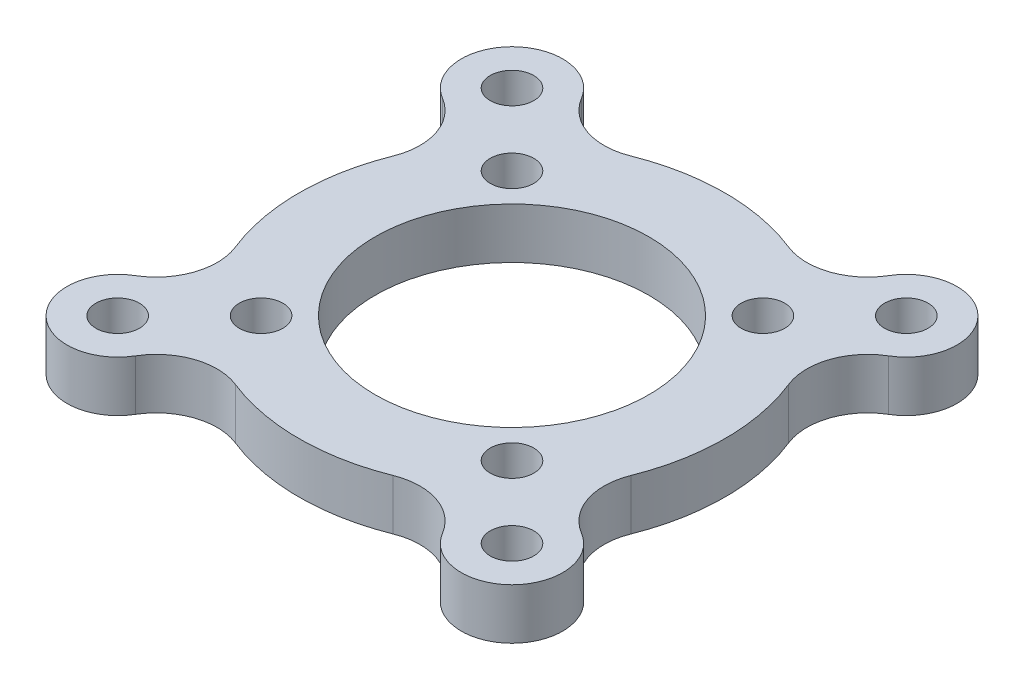
ISO-10303-21;
HEADER;
FILE_DESCRIPTION(('STEP AP214'),'2;1');
FILE_NAME('part.step','',(''),(''),'','','');
FILE_SCHEMA(('AUTOMOTIVE_DESIGN { 1 0 10303 214 1 1 1 1 }'));
ENDSEC;
DATA;
#1=APPLICATION_CONTEXT('core data for automotive mechanical design processes');
#2=APPLICATION_PROTOCOL_DEFINITION('international standard','automotive_design',2000,#1);
#3=PRODUCT_CONTEXT('',#1,'mechanical');
#4=PRODUCT('Part','Part','',(#3));
#5=PRODUCT_RELATED_PRODUCT_CATEGORY('part','',(#4));
#6=PRODUCT_DEFINITION_FORMATION('','',#4);
#7=PRODUCT_DEFINITION_CONTEXT('part definition',#1,'design');
#8=PRODUCT_DEFINITION('design','',#6,#7);
#9=PRODUCT_DEFINITION_SHAPE('','',#8);
#10=(LENGTH_UNIT() NAMED_UNIT(*) SI_UNIT(.MILLI.,.METRE.));
#11=(NAMED_UNIT(*) PLANE_ANGLE_UNIT() SI_UNIT($,.RADIAN.));
#12=(NAMED_UNIT(*) SI_UNIT($,.STERADIAN.) SOLID_ANGLE_UNIT());
#13=UNCERTAINTY_MEASURE_WITH_UNIT(LENGTH_MEASURE(1.E-05),#10,'distance_accuracy_value','');
#14=(GEOMETRIC_REPRESENTATION_CONTEXT(3) GLOBAL_UNCERTAINTY_ASSIGNED_CONTEXT((#13)) GLOBAL_UNIT_ASSIGNED_CONTEXT((#10,
#11,#12)) REPRESENTATION_CONTEXT('',''));
#15=CARTESIAN_POINT('',(0.,0.,0.));
#16=DIRECTION('',(0.,0.,1.));
#17=DIRECTION('',(1.,0.,0.));
#18=AXIS2_PLACEMENT_3D('',#15,#16,#17);
#19=CARTESIAN_POINT('',(4.99921187310644,5.,-12.5402504220526));
#20=DIRECTION('',(0.,-1.,0.));
#21=DIRECTION('',(0.,0.,-1.));
#22=AXIS2_PLACEMENT_3D('',#19,#20,#21);
#23=PLANE('',#22);
#24=CARTESIAN_POINT('',(9.99842374621287,5.,-25.0805008441053));
#25=DIRECTION('',(0.,-1.,0.));
#26=DIRECTION('',(0.,0.,-1.));
#27=AXIS2_PLACEMENT_3D('',#24,#25,#26);
#28=CIRCLE('',#27,6.);
#29=CARTESIAN_POINT('',(15.1513397842587,5.,-22.0068293742097));
#30=VERTEX_POINT('',#29);
#31=CARTESIAN_POINT('',(7.77655180261002,5.,-19.5070562120819));
#32=VERTEX_POINT('',#31);
#33=EDGE_CURVE('E209',#30,#32,#28,.T.);
#34=ORIENTED_EDGE('',*,*,#33,.T.);
#35=CARTESIAN_POINT('',(0.,5.,0.));
#36=DIRECTION('',(0.,1.,0.));
#37=DIRECTION('',(0.,0.,1.));
#38=AXIS2_PLACEMENT_3D('',#35,#36,#37);
#39=CIRCLE('',#38,21.);
#40=CARTESIAN_POINT('',(-7.77655180260977,5.,-19.507056212082));
#41=VERTEX_POINT('',#40);
#42=EDGE_CURVE('E117',#32,#41,#39,.T.);
#43=ORIENTED_EDGE('',*,*,#42,.T.);
#44=CARTESIAN_POINT('',(-9.99842374621257,5.,-25.0805008441054));
#45=DIRECTION('',(0.,-1.,0.));
#46=DIRECTION('',(0.,0.,1.));
#47=AXIS2_PLACEMENT_3D('',#44,#45,#46);
#48=CIRCLE('',#47,6.);
#49=CARTESIAN_POINT('',(-15.1513397842584,5.,-22.0068293742098));
#50=VERTEX_POINT('',#49);
#51=EDGE_CURVE('E248',#41,#50,#48,.T.);
#52=ORIENTED_EDGE('',*,*,#51,.T.);
#53=CARTESIAN_POINT('',(-19.4454364826299,5.,-19.4454364826302));
#54=DIRECTION('',(0.,1.,0.));
#55=DIRECTION('',(0.,0.,1.));
#56=AXIS2_PLACEMENT_3D('',#53,#54,#55);
#57=CIRCLE('',#56,5.);
#58=CARTESIAN_POINT('',(-22.0068293742096,5.,-15.1513397842587));
#59=VERTEX_POINT('',#58);
#60=EDGE_CURVE('E267',#50,#59,#57,.T.);
#61=ORIENTED_EDGE('',*,*,#60,.T.);
#62=CARTESIAN_POINT('',(-25.0805008441053,5.,-9.99842374621291));
#63=DIRECTION('',(0.,-1.,0.));
#64=DIRECTION('',(0.,0.,-1.));
#65=AXIS2_PLACEMENT_3D('',#62,#63,#64);
#66=CIRCLE('',#65,6.);
#67=CARTESIAN_POINT('',(-19.5070562120819,5.,-7.77655180261005));
#68=VERTEX_POINT('',#67);
#69=EDGE_CURVE('E264',#59,#68,#66,.T.);
#70=ORIENTED_EDGE('',*,*,#69,.T.);
#71=CARTESIAN_POINT('',(0.,5.,0.));
#72=DIRECTION('',(0.,1.,0.));
#73=DIRECTION('',(0.,0.,1.));
#74=AXIS2_PLACEMENT_3D('',#71,#72,#73);
#75=CIRCLE('',#74,21.);
#76=CARTESIAN_POINT('',(-19.507056212082,5.,7.77655180260978));
#77=VERTEX_POINT('',#76);
#78=EDGE_CURVE('E266',#68,#77,#75,.T.);
#79=ORIENTED_EDGE('',*,*,#78,.T.);
#80=CARTESIAN_POINT('',(-25.0805008441054,5.,9.99842374621258));
#81=DIRECTION('',(0.,-1.,0.));
#82=DIRECTION('',(0.,0.,1.));
#83=AXIS2_PLACEMENT_3D('',#80,#81,#82);
#84=CIRCLE('',#83,6.);
#85=CARTESIAN_POINT('',(-22.0068293742098,5.,15.1513397842584));
#86=VERTEX_POINT('',#85);
#87=EDGE_CURVE('E269',#77,#86,#84,.T.);
#88=ORIENTED_EDGE('',*,*,#87,.T.);
#89=CARTESIAN_POINT('',(-19.4454364826302,5.,19.4454364826299));
#90=DIRECTION('',(0.,1.,0.));
#91=DIRECTION('',(0.,0.,1.));
#92=AXIS2_PLACEMENT_3D('',#89,#90,#91);
#93=CIRCLE('',#92,5.);
#94=CARTESIAN_POINT('',(-15.1513397842587,5.,22.0068293742096));
#95=VERTEX_POINT('',#94);
#96=EDGE_CURVE('E275',#86,#95,#93,.T.);
#97=ORIENTED_EDGE('',*,*,#96,.T.);
#98=CARTESIAN_POINT('',(-9.99842374621291,5.,25.0805008441053));
#99=DIRECTION('',(0.,-1.,0.));
#100=DIRECTION('',(0.,0.,-1.));
#101=AXIS2_PLACEMENT_3D('',#98,#99,#100);
#102=CIRCLE('',#101,6.);
#103=CARTESIAN_POINT('',(-7.77655180261004,5.,19.5070562120819));
#104=VERTEX_POINT('',#103);
#105=EDGE_CURVE('E277',#95,#104,#102,.T.);
#106=ORIENTED_EDGE('',*,*,#105,.T.);
#107=CARTESIAN_POINT('',(0.,5.,0.));
#108=DIRECTION('',(0.,1.,0.));
#109=DIRECTION('',(0.,0.,1.));
#110=AXIS2_PLACEMENT_3D('',#107,#108,#109);
#111=CIRCLE('',#110,21.);
#112=CARTESIAN_POINT('',(7.77655180260979,5.,19.507056212082));
#113=VERTEX_POINT('',#112);
#114=EDGE_CURVE('E279',#104,#113,#111,.T.);
#115=ORIENTED_EDGE('',*,*,#114,.T.);
#116=CARTESIAN_POINT('',(9.99842374621259,5.,25.0805008441054));
#117=DIRECTION('',(0.,-1.,0.));
#118=DIRECTION('',(0.,0.,1.));
#119=AXIS2_PLACEMENT_3D('',#116,#117,#118);
#120=CIRCLE('',#119,6.);
#121=CARTESIAN_POINT('',(15.1513397842584,5.,22.0068293742098));
#122=VERTEX_POINT('',#121);
#123=EDGE_CURVE('E281',#113,#122,#120,.T.);
#124=ORIENTED_EDGE('',*,*,#123,.T.);
#125=CARTESIAN_POINT('',(19.4454364826299,5.,19.4454364826302));
#126=DIRECTION('',(0.,1.,0.));
#127=DIRECTION('',(0.,0.,1.));
#128=AXIS2_PLACEMENT_3D('',#125,#126,#127);
#129=CIRCLE('',#128,5.);
#130=CARTESIAN_POINT('',(22.0068293742096,5.,15.1513397842587));
#131=VERTEX_POINT('',#130);
#132=EDGE_CURVE('E283',#122,#131,#129,.T.);
#133=ORIENTED_EDGE('',*,*,#132,.T.);
#134=CARTESIAN_POINT('',(25.0805008441053,5.,9.99842374621289));
#135=DIRECTION('',(0.,-1.,0.));
#136=DIRECTION('',(0.,0.,-1.));
#137=AXIS2_PLACEMENT_3D('',#134,#135,#136);
#138=CIRCLE('',#137,6.);
#139=CARTESIAN_POINT('',(19.5070562120819,5.,7.77655180261002));
#140=VERTEX_POINT('',#139);
#141=EDGE_CURVE('E160',#131,#140,#138,.T.);
#142=ORIENTED_EDGE('',*,*,#141,.T.);
#143=CARTESIAN_POINT('',(0.,5.,0.));
#144=DIRECTION('',(0.,1.,0.));
#145=DIRECTION('',(0.,0.,1.));
#146=AXIS2_PLACEMENT_3D('',#143,#144,#145);
#147=CIRCLE('',#146,21.);
#148=CARTESIAN_POINT('',(19.507056212082,5.,-7.7765518026098));
#149=VERTEX_POINT('',#148);
#150=EDGE_CURVE('E154',#140,#149,#147,.T.);
#151=ORIENTED_EDGE('',*,*,#150,.T.);
#152=CARTESIAN_POINT('',(25.0805008441054,5.,-9.99842374621261));
#153=DIRECTION('',(0.,-1.,0.));
#154=DIRECTION('',(0.,0.,1.));
#155=AXIS2_PLACEMENT_3D('',#152,#153,#154);
#156=CIRCLE('',#155,6.);
#157=CARTESIAN_POINT('',(22.0068293742098,5.,-15.1513397842584));
#158=VERTEX_POINT('',#157);
#159=EDGE_CURVE('E158',#149,#158,#156,.T.);
#160=ORIENTED_EDGE('',*,*,#159,.T.);
#161=CARTESIAN_POINT('',(19.4454364826302,5.,-19.44543648263));
#162=DIRECTION('',(0.,1.,0.));
#163=DIRECTION('',(0.,0.,1.));
#164=AXIS2_PLACEMENT_3D('',#161,#162,#163);
#165=CIRCLE('',#164,5.);
#166=EDGE_CURVE('E50',#158,#30,#165,.T.);
#167=ORIENTED_EDGE('',*,*,#166,.T.);
#168=EDGE_LOOP('',(#34,#43,#52,#61,#70,#79,#88,#97,#106,#115,#124,#133,#142,#151,#160,#167));
#169=FACE_BOUND('',#168,.T.);
#170=CARTESIAN_POINT('',(19.4454364826302,5.,-19.44543648263));
#171=DIRECTION('',(0.,1.,0.));
#172=DIRECTION('',(0.,0.,1.));
#173=AXIS2_PLACEMENT_3D('',#170,#171,#172);
#174=CIRCLE('',#173,2.15);
#175=CARTESIAN_POINT('',(19.4454364826302,5.,-17.29543648263));
#176=VERTEX_POINT('',#175);
#177=EDGE_CURVE('E182',#176,#176,#174,.T.);
#178=ORIENTED_EDGE('',*,*,#177,.F.);
#179=EDGE_LOOP('',(#178));
#180=FACE_BOUND('',#179,.T.);
#181=CARTESIAN_POINT('',(0.,5.,0.));
#182=DIRECTION('',(0.,1.,0.));
#183=DIRECTION('',(0.,0.,1.));
#184=AXIS2_PLACEMENT_3D('',#181,#182,#183);
#185=CIRCLE('',#184,13.5);
#186=CARTESIAN_POINT('',(0.,5.,13.5));
#187=VERTEX_POINT('',#186);
#188=EDGE_CURVE('E397',#187,#187,#185,.T.);
#189=ORIENTED_EDGE('',*,*,#188,.F.);
#190=EDGE_LOOP('',(#189));
#191=FACE_BOUND('',#190,.T.);
#192=CARTESIAN_POINT('',(12.3743686707646,5.,-12.3743686707646));
#193=DIRECTION('',(0.,1.,0.));
#194=DIRECTION('',(0.,0.,1.));
#195=AXIS2_PLACEMENT_3D('',#192,#193,#194);
#196=CIRCLE('',#195,2.15000000000001);
#197=CARTESIAN_POINT('',(12.3743686707646,5.,-10.2243686707646));
#198=VERTEX_POINT('',#197);
#199=EDGE_CURVE('E391',#198,#198,#196,.T.);
#200=ORIENTED_EDGE('',*,*,#199,.F.);
#201=EDGE_LOOP('',(#200));
#202=FACE_BOUND('',#201,.T.);
#203=CARTESIAN_POINT('',(19.4454364826299,5.,19.4454364826302));
#204=DIRECTION('',(0.,1.,0.));
#205=DIRECTION('',(0.,0.,1.));
#206=AXIS2_PLACEMENT_3D('',#203,#204,#205);
#207=CIRCLE('',#206,2.15);
#208=CARTESIAN_POINT('',(19.4454364826299,5.,21.5954364826302));
#209=VERTEX_POINT('',#208);
#210=EDGE_CURVE('E385',#209,#209,#207,.T.);
#211=ORIENTED_EDGE('',*,*,#210,.F.);
#212=EDGE_LOOP('',(#211));
#213=FACE_BOUND('',#212,.T.);
#214=CARTESIAN_POINT('',(12.3743686707646,5.,12.3743686707646));
#215=DIRECTION('',(0.,1.,0.));
#216=DIRECTION('',(0.,0.,1.));
#217=AXIS2_PLACEMENT_3D('',#214,#215,#216);
#218=CIRCLE('',#217,2.15);
#219=CARTESIAN_POINT('',(12.3743686707646,5.,14.5243686707646));
#220=VERTEX_POINT('',#219);
#221=EDGE_CURVE('E379',#220,#220,#218,.T.);
#222=ORIENTED_EDGE('',*,*,#221,.F.);
#223=EDGE_LOOP('',(#222));
#224=FACE_BOUND('',#223,.T.);
#225=CARTESIAN_POINT('',(-12.3743686707646,5.,12.3743686707646));
#226=DIRECTION('',(0.,1.,0.));
#227=DIRECTION('',(0.,0.,1.));
#228=AXIS2_PLACEMENT_3D('',#225,#226,#227);
#229=CIRCLE('',#228,2.15);
#230=CARTESIAN_POINT('',(-12.3743686707646,5.,14.5243686707646));
#231=VERTEX_POINT('',#230);
#232=EDGE_CURVE('E373',#231,#231,#229,.T.);
#233=ORIENTED_EDGE('',*,*,#232,.F.);
#234=EDGE_LOOP('',(#233));
#235=FACE_BOUND('',#234,.T.);
#236=CARTESIAN_POINT('',(-12.3743686707646,5.,-12.3743686707646));
#237=DIRECTION('',(0.,1.,0.));
#238=DIRECTION('',(0.,0.,1.));
#239=AXIS2_PLACEMENT_3D('',#236,#237,#238);
#240=CIRCLE('',#239,2.15);
#241=CARTESIAN_POINT('',(-12.3743686707646,5.,-10.2243686707646));
#242=VERTEX_POINT('',#241);
#243=EDGE_CURVE('E367',#242,#242,#240,.T.);
#244=ORIENTED_EDGE('',*,*,#243,.F.);
#245=EDGE_LOOP('',(#244));
#246=FACE_BOUND('',#245,.T.);
#247=CARTESIAN_POINT('',(-19.4454364826302,5.,19.4454364826299));
#248=DIRECTION('',(0.,1.,0.));
#249=DIRECTION('',(0.,0.,1.));
#250=AXIS2_PLACEMENT_3D('',#247,#248,#249);
#251=CIRCLE('',#250,2.15);
#252=CARTESIAN_POINT('',(-19.4454364826302,5.,21.5954364826299));
#253=VERTEX_POINT('',#252);
#254=EDGE_CURVE('E361',#253,#253,#251,.T.);
#255=ORIENTED_EDGE('',*,*,#254,.F.);
#256=EDGE_LOOP('',(#255));
#257=FACE_BOUND('',#256,.T.);
#258=CARTESIAN_POINT('',(-19.4454364826299,5.,-19.4454364826302));
#259=DIRECTION('',(0.,1.,0.));
#260=DIRECTION('',(0.,0.,1.));
#261=AXIS2_PLACEMENT_3D('',#258,#259,#260);
#262=CIRCLE('',#261,2.15);
#263=CARTESIAN_POINT('',(-19.4454364826299,5.,-17.2954364826302));
#264=VERTEX_POINT('',#263);
#265=EDGE_CURVE('E352',#264,#264,#262,.T.);
#266=ORIENTED_EDGE('',*,*,#265,.F.);
#267=EDGE_LOOP('',(#266));
#268=FACE_BOUND('',#267,.T.);
#269=ADVANCED_FACE('F33',(#169,#180,#191,#202,#213,#224,#235,#246,#257,#268),#23,.F.);
#270=CARTESIAN_POINT('',(4.99921187310644,0.,-12.5402504220526));
#271=DIRECTION('',(0.,-1.,0.));
#272=DIRECTION('',(0.,0.,-1.));
#273=AXIS2_PLACEMENT_3D('',#270,#271,#272);
#274=PLANE('',#273);
#275=CARTESIAN_POINT('',(-19.4454364826302,0.,19.4454364826299));
#276=DIRECTION('',(0.,1.,0.));
#277=DIRECTION('',(0.,0.,1.));
#278=AXIS2_PLACEMENT_3D('',#275,#276,#277);
#279=CIRCLE('',#278,2.15);
#280=CARTESIAN_POINT('',(-19.4454364826302,0.,21.5954364826299));
#281=VERTEX_POINT('',#280);
#282=EDGE_CURVE('E358',#281,#281,#279,.T.);
#283=ORIENTED_EDGE('',*,*,#282,.T.);
#284=EDGE_LOOP('',(#283));
#285=FACE_BOUND('',#284,.T.);
#286=CARTESIAN_POINT('',(-12.3743686707646,0.,12.3743686707646));
#287=DIRECTION('',(0.,1.,0.));
#288=DIRECTION('',(0.,0.,1.));
#289=AXIS2_PLACEMENT_3D('',#286,#287,#288);
#290=CIRCLE('',#289,2.15);
#291=CARTESIAN_POINT('',(-12.3743686707646,0.,14.5243686707646));
#292=VERTEX_POINT('',#291);
#293=EDGE_CURVE('E370',#292,#292,#290,.T.);
#294=ORIENTED_EDGE('',*,*,#293,.T.);
#295=EDGE_LOOP('',(#294));
#296=FACE_BOUND('',#295,.T.);
#297=CARTESIAN_POINT('',(19.4454364826299,0.,19.4454364826302));
#298=DIRECTION('',(0.,1.,0.));
#299=DIRECTION('',(0.,0.,1.));
#300=AXIS2_PLACEMENT_3D('',#297,#298,#299);
#301=CIRCLE('',#300,2.15);
#302=CARTESIAN_POINT('',(19.4454364826299,0.,21.5954364826302));
#303=VERTEX_POINT('',#302);
#304=EDGE_CURVE('E382',#303,#303,#301,.T.);
#305=ORIENTED_EDGE('',*,*,#304,.T.);
#306=EDGE_LOOP('',(#305));
#307=FACE_BOUND('',#306,.T.);
#308=CARTESIAN_POINT('',(0.,0.,0.));
#309=DIRECTION('',(0.,1.,0.));
#310=DIRECTION('',(0.,0.,1.));
#311=AXIS2_PLACEMENT_3D('',#308,#309,#310);
#312=CIRCLE('',#311,13.5);
#313=CARTESIAN_POINT('',(0.,0.,13.5));
#314=VERTEX_POINT('',#313);
#315=EDGE_CURVE('E394',#314,#314,#312,.T.);
#316=ORIENTED_EDGE('',*,*,#315,.T.);
#317=EDGE_LOOP('',(#316));
#318=FACE_BOUND('',#317,.T.);
#319=CARTESIAN_POINT('',(9.99842374621287,0.,-25.0805008441053));
#320=DIRECTION('',(0.,-1.,0.));
#321=DIRECTION('',(0.,0.,-1.));
#322=AXIS2_PLACEMENT_3D('',#319,#320,#321);
#323=CIRCLE('',#322,6.);
#324=CARTESIAN_POINT('',(15.1513397842587,0.,-22.0068293742097));
#325=VERTEX_POINT('',#324);
#326=CARTESIAN_POINT('',(7.77655180261002,0.,-19.5070562120819));
#327=VERTEX_POINT('',#326);
#328=EDGE_CURVE('E178',#325,#327,#323,.T.);
#329=ORIENTED_EDGE('',*,*,#328,.F.);
#330=CARTESIAN_POINT('',(19.4454364826302,0.,-19.44543648263));
#331=DIRECTION('',(0.,1.,0.));
#332=DIRECTION('',(0.,0.,1.));
#333=AXIS2_PLACEMENT_3D('',#330,#331,#332);
#334=CIRCLE('',#333,5.);
#335=CARTESIAN_POINT('',(22.0068293742098,0.,-15.1513397842584));
#336=VERTEX_POINT('',#335);
#337=EDGE_CURVE('E109',#336,#325,#334,.T.);
#338=ORIENTED_EDGE('',*,*,#337,.F.);
#339=CARTESIAN_POINT('',(25.0805008441054,0.,-9.99842374621261));
#340=DIRECTION('',(0.,-1.,0.));
#341=DIRECTION('',(0.,0.,1.));
#342=AXIS2_PLACEMENT_3D('',#339,#340,#341);
#343=CIRCLE('',#342,6.);
#344=CARTESIAN_POINT('',(19.507056212082,0.,-7.7765518026098));
#345=VERTEX_POINT('',#344);
#346=EDGE_CURVE('E103',#345,#336,#343,.T.);
#347=ORIENTED_EDGE('',*,*,#346,.F.);
#348=CARTESIAN_POINT('',(0.,0.,0.));
#349=DIRECTION('',(0.,1.,0.));
#350=DIRECTION('',(0.,0.,1.));
#351=AXIS2_PLACEMENT_3D('',#348,#349,#350);
#352=CIRCLE('',#351,21.);
#353=CARTESIAN_POINT('',(19.5070562120819,0.,7.77655180261002));
#354=VERTEX_POINT('',#353);
#355=EDGE_CURVE('E168',#354,#345,#352,.T.);
#356=ORIENTED_EDGE('',*,*,#355,.F.);
#357=CARTESIAN_POINT('',(25.0805008441053,0.,9.99842374621289));
#358=DIRECTION('',(0.,-1.,0.));
#359=DIRECTION('',(0.,0.,-1.));
#360=AXIS2_PLACEMENT_3D('',#357,#358,#359);
#361=CIRCLE('',#360,6.);
#362=CARTESIAN_POINT('',(22.0068293742096,0.,15.1513397842587));
#363=VERTEX_POINT('',#362);
#364=EDGE_CURVE('E204',#363,#354,#361,.T.);
#365=ORIENTED_EDGE('',*,*,#364,.F.);
#366=CARTESIAN_POINT('',(19.4454364826299,0.,19.4454364826302));
#367=DIRECTION('',(0.,1.,0.));
#368=DIRECTION('',(0.,0.,1.));
#369=AXIS2_PLACEMENT_3D('',#366,#367,#368);
#370=CIRCLE('',#369,5.);
#371=CARTESIAN_POINT('',(15.1513397842584,0.,22.0068293742098));
#372=VERTEX_POINT('',#371);
#373=EDGE_CURVE('E202',#372,#363,#370,.T.);
#374=ORIENTED_EDGE('',*,*,#373,.F.);
#375=CARTESIAN_POINT('',(9.99842374621259,0.,25.0805008441054));
#376=DIRECTION('',(0.,-1.,0.));
#377=DIRECTION('',(0.,0.,1.));
#378=AXIS2_PLACEMENT_3D('',#375,#376,#377);
#379=CIRCLE('',#378,6.);
#380=CARTESIAN_POINT('',(7.77655180260979,0.,19.507056212082));
#381=VERTEX_POINT('',#380);
#382=EDGE_CURVE('E200',#381,#372,#379,.T.);
#383=ORIENTED_EDGE('',*,*,#382,.F.);
#384=CARTESIAN_POINT('',(0.,0.,0.));
#385=DIRECTION('',(0.,1.,0.));
#386=DIRECTION('',(0.,0.,1.));
#387=AXIS2_PLACEMENT_3D('',#384,#385,#386);
#388=CIRCLE('',#387,21.);
#389=CARTESIAN_POINT('',(-7.77655180261004,0.,19.5070562120819));
#390=VERTEX_POINT('',#389);
#391=EDGE_CURVE('E198',#390,#381,#388,.T.);
#392=ORIENTED_EDGE('',*,*,#391,.F.);
#393=CARTESIAN_POINT('',(-9.99842374621291,0.,25.0805008441053));
#394=DIRECTION('',(0.,-1.,0.));
#395=DIRECTION('',(0.,0.,-1.));
#396=AXIS2_PLACEMENT_3D('',#393,#394,#395);
#397=CIRCLE('',#396,6.);
#398=CARTESIAN_POINT('',(-15.1513397842587,0.,22.0068293742096));
#399=VERTEX_POINT('',#398);
#400=EDGE_CURVE('E196',#399,#390,#397,.T.);
#401=ORIENTED_EDGE('',*,*,#400,.F.);
#402=CARTESIAN_POINT('',(-19.4454364826302,0.,19.4454364826299));
#403=DIRECTION('',(0.,1.,0.));
#404=DIRECTION('',(0.,0.,1.));
#405=AXIS2_PLACEMENT_3D('',#402,#403,#404);
#406=CIRCLE('',#405,5.);
#407=CARTESIAN_POINT('',(-22.0068293742098,0.,15.1513397842584));
#408=VERTEX_POINT('',#407);
#409=EDGE_CURVE('E194',#408,#399,#406,.T.);
#410=ORIENTED_EDGE('',*,*,#409,.F.);
#411=CARTESIAN_POINT('',(-25.0805008441054,0.,9.99842374621258));
#412=DIRECTION('',(0.,-1.,0.));
#413=DIRECTION('',(0.,0.,1.));
#414=AXIS2_PLACEMENT_3D('',#411,#412,#413);
#415=CIRCLE('',#414,6.);
#416=CARTESIAN_POINT('',(-19.507056212082,0.,7.77655180260978));
#417=VERTEX_POINT('',#416);
#418=EDGE_CURVE('E192',#417,#408,#415,.T.);
#419=ORIENTED_EDGE('',*,*,#418,.F.);
#420=CARTESIAN_POINT('',(0.,0.,0.));
#421=DIRECTION('',(0.,1.,0.));
#422=DIRECTION('',(0.,0.,1.));
#423=AXIS2_PLACEMENT_3D('',#420,#421,#422);
#424=CIRCLE('',#423,21.);
#425=CARTESIAN_POINT('',(-19.5070562120819,0.,-7.77655180261005));
#426=VERTEX_POINT('',#425);
#427=EDGE_CURVE('E190',#426,#417,#424,.T.);
#428=ORIENTED_EDGE('',*,*,#427,.F.);
#429=CARTESIAN_POINT('',(-25.0805008441053,0.,-9.99842374621291));
#430=DIRECTION('',(0.,-1.,0.));
#431=DIRECTION('',(0.,0.,-1.));
#432=AXIS2_PLACEMENT_3D('',#429,#430,#431);
#433=CIRCLE('',#432,6.);
#434=CARTESIAN_POINT('',(-22.0068293742096,0.,-15.1513397842587));
#435=VERTEX_POINT('',#434);
#436=EDGE_CURVE('E188',#435,#426,#433,.T.);
#437=ORIENTED_EDGE('',*,*,#436,.F.);
#438=CARTESIAN_POINT('',(-19.4454364826299,0.,-19.4454364826302));
#439=DIRECTION('',(0.,1.,0.));
#440=DIRECTION('',(0.,0.,1.));
#441=AXIS2_PLACEMENT_3D('',#438,#439,#440);
#442=CIRCLE('',#441,5.);
#443=CARTESIAN_POINT('',(-15.1513397842584,0.,-22.0068293742098));
#444=VERTEX_POINT('',#443);
#445=EDGE_CURVE('E186',#444,#435,#442,.T.);
#446=ORIENTED_EDGE('',*,*,#445,.F.);
#447=CARTESIAN_POINT('',(-9.99842374621257,0.,-25.0805008441054));
#448=DIRECTION('',(0.,-1.,0.));
#449=DIRECTION('',(0.,0.,1.));
#450=AXIS2_PLACEMENT_3D('',#447,#448,#449);
#451=CIRCLE('',#450,6.);
#452=CARTESIAN_POINT('',(-7.77655180260977,0.,-19.507056212082));
#453=VERTEX_POINT('',#452);
#454=EDGE_CURVE('E184',#453,#444,#451,.T.);
#455=ORIENTED_EDGE('',*,*,#454,.F.);
#456=CARTESIAN_POINT('',(0.,0.,0.));
#457=DIRECTION('',(0.,1.,0.));
#458=DIRECTION('',(0.,0.,1.));
#459=AXIS2_PLACEMENT_3D('',#456,#457,#458);
#460=CIRCLE('',#459,21.);
#461=EDGE_CURVE('E181',#327,#453,#460,.T.);
#462=ORIENTED_EDGE('',*,*,#461,.F.);
#463=EDGE_LOOP('',(#329,#338,#347,#356,#365,#374,#383,#392,#401,#410,#419,#428,#437,#446,#455,#462));
#464=FACE_BOUND('',#463,.T.);
#465=CARTESIAN_POINT('',(19.4454364826302,0.,-19.44543648263));
#466=DIRECTION('',(0.,1.,0.));
#467=DIRECTION('',(0.,0.,1.));
#468=AXIS2_PLACEMENT_3D('',#465,#466,#467);
#469=CIRCLE('',#468,2.15);
#470=CARTESIAN_POINT('',(19.4454364826302,0.,-17.29543648263));
#471=VERTEX_POINT('',#470);
#472=EDGE_CURVE('E400',#471,#471,#469,.T.);
#473=ORIENTED_EDGE('',*,*,#472,.T.);
#474=EDGE_LOOP('',(#473));
#475=FACE_BOUND('',#474,.T.);
#476=CARTESIAN_POINT('',(12.3743686707646,0.,-12.3743686707646));
#477=DIRECTION('',(0.,1.,0.));
#478=DIRECTION('',(0.,0.,1.));
#479=AXIS2_PLACEMENT_3D('',#476,#477,#478);
#480=CIRCLE('',#479,2.15000000000001);
#481=CARTESIAN_POINT('',(12.3743686707646,0.,-10.2243686707646));
#482=VERTEX_POINT('',#481);
#483=EDGE_CURVE('E388',#482,#482,#480,.T.);
#484=ORIENTED_EDGE('',*,*,#483,.T.);
#485=EDGE_LOOP('',(#484));
#486=FACE_BOUND('',#485,.T.);
#487=CARTESIAN_POINT('',(12.3743686707646,0.,12.3743686707646));
#488=DIRECTION('',(0.,1.,0.));
#489=DIRECTION('',(0.,0.,1.));
#490=AXIS2_PLACEMENT_3D('',#487,#488,#489);
#491=CIRCLE('',#490,2.15);
#492=CARTESIAN_POINT('',(12.3743686707646,0.,14.5243686707646));
#493=VERTEX_POINT('',#492);
#494=EDGE_CURVE('E376',#493,#493,#491,.T.);
#495=ORIENTED_EDGE('',*,*,#494,.T.);
#496=EDGE_LOOP('',(#495));
#497=FACE_BOUND('',#496,.T.);
#498=CARTESIAN_POINT('',(-12.3743686707646,0.,-12.3743686707646));
#499=DIRECTION('',(0.,1.,0.));
#500=DIRECTION('',(0.,0.,1.));
#501=AXIS2_PLACEMENT_3D('',#498,#499,#500);
#502=CIRCLE('',#501,2.15);
#503=CARTESIAN_POINT('',(-12.3743686707646,0.,-10.2243686707646));
#504=VERTEX_POINT('',#503);
#505=EDGE_CURVE('E364',#504,#504,#502,.T.);
#506=ORIENTED_EDGE('',*,*,#505,.T.);
#507=EDGE_LOOP('',(#506));
#508=FACE_BOUND('',#507,.T.);
#509=CARTESIAN_POINT('',(-19.4454364826299,0.,-19.4454364826302));
#510=DIRECTION('',(0.,1.,0.));
#511=DIRECTION('',(0.,0.,1.));
#512=AXIS2_PLACEMENT_3D('',#509,#510,#511);
#513=CIRCLE('',#512,2.15);
#514=CARTESIAN_POINT('',(-19.4454364826299,0.,-17.2954364826302));
#515=VERTEX_POINT('',#514);
#516=EDGE_CURVE('E355',#515,#515,#513,.T.);
#517=ORIENTED_EDGE('',*,*,#516,.T.);
#518=EDGE_LOOP('',(#517));
#519=FACE_BOUND('',#518,.T.);
#520=ADVANCED_FACE('F252',(#285,#296,#307,#318,#464,#475,#486,#497,#508,#519),#274,.T.);
#521=CARTESIAN_POINT('',(9.99842374621287,5.,-25.0805008441053));
#522=DIRECTION('',(0.,-1.,0.));
#523=DIRECTION('',(0.,0.,-1.));
#524=AXIS2_PLACEMENT_3D('',#521,#522,#523);
#525=CYLINDRICAL_SURFACE('',#524,6.);
#526=ORIENTED_EDGE('',*,*,#328,.T.);
#527=DIRECTION('',(0.,-1.,0.));
#528=VECTOR('',#527,1.);
#529=CARTESIAN_POINT('',(7.77655180261002,5.,-19.5070562120819));
#530=LINE('',#529,#528);
#531=EDGE_CURVE('E11',#32,#327,#530,.T.);
#532=ORIENTED_EDGE('',*,*,#531,.F.);
#533=ORIENTED_EDGE('',*,*,#33,.F.);
#534=DIRECTION('',(0.,-1.,0.));
#535=VECTOR('',#534,1.);
#536=CARTESIAN_POINT('',(15.1513397842587,5.,-22.0068293742097));
#537=LINE('',#536,#535);
#538=EDGE_CURVE('E174',#30,#325,#537,.T.);
#539=ORIENTED_EDGE('',*,*,#538,.T.);
#540=EDGE_LOOP('',(#526,#532,#533,#539));
#541=FACE_BOUND('',#540,.T.);
#542=ADVANCED_FACE('F35',(#541),#525,.F.);
#543=CARTESIAN_POINT('',(0.,5.,0.));
#544=DIRECTION('',(0.,-1.,0.));
#545=DIRECTION('',(0.,0.,-1.));
#546=AXIS2_PLACEMENT_3D('',#543,#544,#545);
#547=CYLINDRICAL_SURFACE('',#546,21.);
#548=ORIENTED_EDGE('',*,*,#461,.T.);
#549=DIRECTION('',(0.,-1.,0.));
#550=VECTOR('',#549,1.);
#551=CARTESIAN_POINT('',(-7.77655180260977,5.,-19.507056212082));
#552=LINE('',#551,#550);
#553=EDGE_CURVE('E42',#41,#453,#552,.T.);
#554=ORIENTED_EDGE('',*,*,#553,.F.);
#555=ORIENTED_EDGE('',*,*,#42,.F.);
#556=ORIENTED_EDGE('',*,*,#531,.T.);
#557=EDGE_LOOP('',(#548,#554,#555,#556));
#558=FACE_BOUND('',#557,.T.);
#559=ADVANCED_FACE('F597',(#558),#547,.T.);
#560=CARTESIAN_POINT('',(-9.99842374621257,5.,-25.0805008441054));
#561=DIRECTION('',(0.,-1.,0.));
#562=DIRECTION('',(0.,0.,-1.));
#563=AXIS2_PLACEMENT_3D('',#560,#561,#562);
#564=CYLINDRICAL_SURFACE('',#563,6.);
#565=ORIENTED_EDGE('',*,*,#454,.T.);
#566=DIRECTION('',(0.,-1.,0.));
#567=VECTOR('',#566,1.);
#568=CARTESIAN_POINT('',(-15.1513397842584,5.,-22.0068293742098));
#569=LINE('',#568,#567);
#570=EDGE_CURVE('E240',#50,#444,#569,.T.);
#571=ORIENTED_EDGE('',*,*,#570,.F.);
#572=ORIENTED_EDGE('',*,*,#51,.F.);
#573=ORIENTED_EDGE('',*,*,#553,.T.);
#574=EDGE_LOOP('',(#565,#571,#572,#573));
#575=FACE_BOUND('',#574,.T.);
#576=ADVANCED_FACE('F246',(#575),#564,.F.);
#577=CARTESIAN_POINT('',(-19.4454364826299,5.,-19.4454364826302));
#578=DIRECTION('',(0.,-1.,0.));
#579=DIRECTION('',(0.,0.,-1.));
#580=AXIS2_PLACEMENT_3D('',#577,#578,#579);
#581=CYLINDRICAL_SURFACE('',#580,5.);
#582=ORIENTED_EDGE('',*,*,#445,.T.);
#583=DIRECTION('',(0.,-1.,0.));
#584=VECTOR('',#583,1.);
#585=CARTESIAN_POINT('',(-22.0068293742096,5.,-15.1513397842587));
#586=LINE('',#585,#584);
#587=EDGE_CURVE('E237',#59,#435,#586,.T.);
#588=ORIENTED_EDGE('',*,*,#587,.F.);
#589=ORIENTED_EDGE('',*,*,#60,.F.);
#590=ORIENTED_EDGE('',*,*,#570,.T.);
#591=EDGE_LOOP('',(#582,#588,#589,#590));
#592=FACE_BOUND('',#591,.T.);
#593=ADVANCED_FACE('F258',(#592),#581,.T.);
#594=CARTESIAN_POINT('',(-25.0805008441053,5.,-9.99842374621291));
#595=DIRECTION('',(0.,-1.,0.));
#596=DIRECTION('',(0.,0.,-1.));
#597=AXIS2_PLACEMENT_3D('',#594,#595,#596);
#598=CYLINDRICAL_SURFACE('',#597,6.);
#599=ORIENTED_EDGE('',*,*,#436,.T.);
#600=DIRECTION('',(0.,-1.,0.));
#601=VECTOR('',#600,1.);
#602=CARTESIAN_POINT('',(-19.5070562120819,5.,-7.77655180261005));
#603=LINE('',#602,#601);
#604=EDGE_CURVE('E234',#68,#426,#603,.T.);
#605=ORIENTED_EDGE('',*,*,#604,.F.);
#606=ORIENTED_EDGE('',*,*,#69,.F.);
#607=ORIENTED_EDGE('',*,*,#587,.T.);
#608=EDGE_LOOP('',(#599,#605,#606,#607));
#609=FACE_BOUND('',#608,.T.);
#610=ADVANCED_FACE('F262',(#609),#598,.F.);
#611=CARTESIAN_POINT('',(0.,5.,0.));
#612=DIRECTION('',(0.,-1.,0.));
#613=DIRECTION('',(0.,0.,-1.));
#614=AXIS2_PLACEMENT_3D('',#611,#612,#613);
#615=CYLINDRICAL_SURFACE('',#614,21.);
#616=ORIENTED_EDGE('',*,*,#427,.T.);
#617=DIRECTION('',(0.,-1.,0.));
#618=VECTOR('',#617,1.);
#619=CARTESIAN_POINT('',(-19.507056212082,5.,7.77655180260978));
#620=LINE('',#619,#618);
#621=EDGE_CURVE('E231',#77,#417,#620,.T.);
#622=ORIENTED_EDGE('',*,*,#621,.F.);
#623=ORIENTED_EDGE('',*,*,#78,.F.);
#624=ORIENTED_EDGE('',*,*,#604,.T.);
#625=EDGE_LOOP('',(#616,#622,#623,#624));
#626=FACE_BOUND('',#625,.T.);
#627=ADVANCED_FACE('F562',(#626),#615,.T.);
#628=CARTESIAN_POINT('',(-25.0805008441054,5.,9.99842374621258));
#629=DIRECTION('',(0.,-1.,0.));
#630=DIRECTION('',(0.,0.,-1.));
#631=AXIS2_PLACEMENT_3D('',#628,#629,#630);
#632=CYLINDRICAL_SURFACE('',#631,6.);
#633=ORIENTED_EDGE('',*,*,#418,.T.);
#634=DIRECTION('',(0.,-1.,0.));
#635=VECTOR('',#634,1.);
#636=CARTESIAN_POINT('',(-22.0068293742098,5.,15.1513397842584));
#637=LINE('',#636,#635);
#638=EDGE_CURVE('E228',#86,#408,#637,.T.);
#639=ORIENTED_EDGE('',*,*,#638,.F.);
#640=ORIENTED_EDGE('',*,*,#87,.F.);
#641=ORIENTED_EDGE('',*,*,#621,.T.);
#642=EDGE_LOOP('',(#633,#639,#640,#641));
#643=FACE_BOUND('',#642,.T.);
#644=ADVANCED_FACE('F552',(#643),#632,.F.);
#645=CARTESIAN_POINT('',(-19.4454364826302,5.,19.4454364826299));
#646=DIRECTION('',(0.,-1.,0.));
#647=DIRECTION('',(0.,0.,-1.));
#648=AXIS2_PLACEMENT_3D('',#645,#646,#647);
#649=CYLINDRICAL_SURFACE('',#648,5.);
#650=ORIENTED_EDGE('',*,*,#409,.T.);
#651=DIRECTION('',(0.,-1.,0.));
#652=VECTOR('',#651,1.);
#653=CARTESIAN_POINT('',(-15.1513397842587,5.,22.0068293742096));
#654=LINE('',#653,#652);
#655=EDGE_CURVE('E225',#95,#399,#654,.T.);
#656=ORIENTED_EDGE('',*,*,#655,.F.);
#657=ORIENTED_EDGE('',*,*,#96,.F.);
#658=ORIENTED_EDGE('',*,*,#638,.T.);
#659=EDGE_LOOP('',(#650,#656,#657,#658));
#660=FACE_BOUND('',#659,.T.);
#661=ADVANCED_FACE('F542',(#660),#649,.T.);
#662=CARTESIAN_POINT('',(-9.99842374621291,5.,25.0805008441053));
#663=DIRECTION('',(0.,-1.,0.));
#664=DIRECTION('',(0.,0.,-1.));
#665=AXIS2_PLACEMENT_3D('',#662,#663,#664);
#666=CYLINDRICAL_SURFACE('',#665,6.);
#667=ORIENTED_EDGE('',*,*,#400,.T.);
#668=DIRECTION('',(0.,-1.,0.));
#669=VECTOR('',#668,1.);
#670=CARTESIAN_POINT('',(-7.77655180261004,5.,19.5070562120819));
#671=LINE('',#670,#669);
#672=EDGE_CURVE('E222',#104,#390,#671,.T.);
#673=ORIENTED_EDGE('',*,*,#672,.F.);
#674=ORIENTED_EDGE('',*,*,#105,.F.);
#675=ORIENTED_EDGE('',*,*,#655,.T.);
#676=EDGE_LOOP('',(#667,#673,#674,#675));
#677=FACE_BOUND('',#676,.T.);
#678=ADVANCED_FACE('F532',(#677),#666,.F.);
#679=CARTESIAN_POINT('',(0.,5.,0.));
#680=DIRECTION('',(0.,-1.,0.));
#681=DIRECTION('',(0.,0.,-1.));
#682=AXIS2_PLACEMENT_3D('',#679,#680,#681);
#683=CYLINDRICAL_SURFACE('',#682,21.);
#684=ORIENTED_EDGE('',*,*,#391,.T.);
#685=DIRECTION('',(0.,-1.,0.));
#686=VECTOR('',#685,1.);
#687=CARTESIAN_POINT('',(7.77655180260979,5.,19.507056212082));
#688=LINE('',#687,#686);
#689=EDGE_CURVE('E219',#113,#381,#688,.T.);
#690=ORIENTED_EDGE('',*,*,#689,.F.);
#691=ORIENTED_EDGE('',*,*,#114,.F.);
#692=ORIENTED_EDGE('',*,*,#672,.T.);
#693=EDGE_LOOP('',(#684,#690,#691,#692));
#694=FACE_BOUND('',#693,.T.);
#695=ADVANCED_FACE('F522',(#694),#683,.T.);
#696=CARTESIAN_POINT('',(9.99842374621259,5.,25.0805008441054));
#697=DIRECTION('',(0.,-1.,0.));
#698=DIRECTION('',(0.,0.,-1.));
#699=AXIS2_PLACEMENT_3D('',#696,#697,#698);
#700=CYLINDRICAL_SURFACE('',#699,6.);
#701=ORIENTED_EDGE('',*,*,#382,.T.);
#702=DIRECTION('',(0.,-1.,0.));
#703=VECTOR('',#702,1.);
#704=CARTESIAN_POINT('',(15.1513397842584,5.,22.0068293742098));
#705=LINE('',#704,#703);
#706=EDGE_CURVE('E216',#122,#372,#705,.T.);
#707=ORIENTED_EDGE('',*,*,#706,.F.);
#708=ORIENTED_EDGE('',*,*,#123,.F.);
#709=ORIENTED_EDGE('',*,*,#689,.T.);
#710=EDGE_LOOP('',(#701,#707,#708,#709));
#711=FACE_BOUND('',#710,.T.);
#712=ADVANCED_FACE('F513',(#711),#700,.F.);
#713=CARTESIAN_POINT('',(19.4454364826299,5.,19.4454364826302));
#714=DIRECTION('',(0.,-1.,0.));
#715=DIRECTION('',(0.,0.,-1.));
#716=AXIS2_PLACEMENT_3D('',#713,#714,#715);
#717=CYLINDRICAL_SURFACE('',#716,5.);
#718=ORIENTED_EDGE('',*,*,#373,.T.);
#719=DIRECTION('',(0.,-1.,0.));
#720=VECTOR('',#719,1.);
#721=CARTESIAN_POINT('',(22.0068293742096,5.,15.1513397842587));
#722=LINE('',#721,#720);
#723=EDGE_CURVE('E213',#131,#363,#722,.T.);
#724=ORIENTED_EDGE('',*,*,#723,.F.);
#725=ORIENTED_EDGE('',*,*,#132,.F.);
#726=ORIENTED_EDGE('',*,*,#706,.T.);
#727=EDGE_LOOP('',(#718,#724,#725,#726));
#728=FACE_BOUND('',#727,.T.);
#729=ADVANCED_FACE('F289',(#728),#717,.T.);
#730=CARTESIAN_POINT('',(25.0805008441053,5.,9.99842374621289));
#731=DIRECTION('',(0.,-1.,0.));
#732=DIRECTION('',(0.,0.,-1.));
#733=AXIS2_PLACEMENT_3D('',#730,#731,#732);
#734=CYLINDRICAL_SURFACE('',#733,6.);
#735=ORIENTED_EDGE('',*,*,#364,.T.);
#736=DIRECTION('',(0.,-1.,0.));
#737=VECTOR('',#736,1.);
#738=CARTESIAN_POINT('',(19.5070562120819,5.,7.77655180261002));
#739=LINE('',#738,#737);
#740=EDGE_CURVE('E169',#140,#354,#739,.T.);
#741=ORIENTED_EDGE('',*,*,#740,.F.);
#742=ORIENTED_EDGE('',*,*,#141,.F.);
#743=ORIENTED_EDGE('',*,*,#723,.T.);
#744=EDGE_LOOP('',(#735,#741,#742,#743));
#745=FACE_BOUND('',#744,.T.);
#746=ADVANCED_FACE('F293',(#745),#734,.F.);
#747=CARTESIAN_POINT('',(0.,5.,0.));
#748=DIRECTION('',(0.,-1.,0.));
#749=DIRECTION('',(0.,0.,-1.));
#750=AXIS2_PLACEMENT_3D('',#747,#748,#749);
#751=CYLINDRICAL_SURFACE('',#750,21.);
#752=ORIENTED_EDGE('',*,*,#355,.T.);
#753=DIRECTION('',(0.,-1.,0.));
#754=VECTOR('',#753,1.);
#755=CARTESIAN_POINT('',(19.507056212082,5.,-7.7765518026098));
#756=LINE('',#755,#754);
#757=EDGE_CURVE('E165',#149,#345,#756,.T.);
#758=ORIENTED_EDGE('',*,*,#757,.F.);
#759=ORIENTED_EDGE('',*,*,#150,.F.);
#760=ORIENTED_EDGE('',*,*,#740,.T.);
#761=EDGE_LOOP('',(#752,#758,#759,#760));
#762=FACE_BOUND('',#761,.T.);
#763=ADVANCED_FACE('F166',(#762),#751,.T.);
#764=CARTESIAN_POINT('',(25.0805008441054,5.,-9.99842374621261));
#765=DIRECTION('',(0.,-1.,0.));
#766=DIRECTION('',(0.,0.,-1.));
#767=AXIS2_PLACEMENT_3D('',#764,#765,#766);
#768=CYLINDRICAL_SURFACE('',#767,6.);
#769=ORIENTED_EDGE('',*,*,#346,.T.);
#770=DIRECTION('',(0.,-1.,0.));
#771=VECTOR('',#770,1.);
#772=CARTESIAN_POINT('',(22.0068293742098,5.,-15.1513397842584));
#773=LINE('',#772,#771);
#774=EDGE_CURVE('E170',#158,#336,#773,.T.);
#775=ORIENTED_EDGE('',*,*,#774,.F.);
#776=ORIENTED_EDGE('',*,*,#159,.F.);
#777=ORIENTED_EDGE('',*,*,#757,.T.);
#778=EDGE_LOOP('',(#769,#775,#776,#777));
#779=FACE_BOUND('',#778,.T.);
#780=ADVANCED_FACE('F172',(#779),#768,.F.);
#781=CARTESIAN_POINT('',(19.4454364826302,5.,-19.44543648263));
#782=DIRECTION('',(0.,-1.,0.));
#783=DIRECTION('',(0.,0.,-1.));
#784=AXIS2_PLACEMENT_3D('',#781,#782,#783);
#785=CYLINDRICAL_SURFACE('',#784,5.);
#786=ORIENTED_EDGE('',*,*,#337,.T.);
#787=ORIENTED_EDGE('',*,*,#538,.F.);
#788=ORIENTED_EDGE('',*,*,#166,.F.);
#789=ORIENTED_EDGE('',*,*,#774,.T.);
#790=EDGE_LOOP('',(#786,#787,#788,#789));
#791=FACE_BOUND('',#790,.T.);
#792=ADVANCED_FACE('F297',(#791),#785,.T.);
#793=CARTESIAN_POINT('',(19.4454364826302,5.,-19.44543648263));
#794=DIRECTION('',(0.,-1.,0.));
#795=DIRECTION('',(0.,0.,-1.));
#796=AXIS2_PLACEMENT_3D('',#793,#794,#795);
#797=CYLINDRICAL_SURFACE('',#796,2.15);
#798=ORIENTED_EDGE('',*,*,#177,.T.);
#799=EDGE_LOOP('',(#798));
#800=FACE_BOUND('',#799,.T.);
#801=ORIENTED_EDGE('',*,*,#472,.F.);
#802=EDGE_LOOP('',(#801));
#803=FACE_BOUND('',#802,.T.);
#804=ADVANCED_FACE('F299',(#800,#803),#797,.F.);
#805=CARTESIAN_POINT('',(0.,5.,0.));
#806=DIRECTION('',(0.,-1.,0.));
#807=DIRECTION('',(0.,0.,-1.));
#808=AXIS2_PLACEMENT_3D('',#805,#806,#807);
#809=CYLINDRICAL_SURFACE('',#808,13.5);
#810=ORIENTED_EDGE('',*,*,#188,.T.);
#811=EDGE_LOOP('',(#810));
#812=FACE_BOUND('',#811,.T.);
#813=ORIENTED_EDGE('',*,*,#315,.F.);
#814=EDGE_LOOP('',(#813));
#815=FACE_BOUND('',#814,.T.);
#816=ADVANCED_FACE('F305',(#812,#815),#809,.F.);
#817=CARTESIAN_POINT('',(12.3743686707646,5.,-12.3743686707646));
#818=DIRECTION('',(0.,-1.,0.));
#819=DIRECTION('',(0.,0.,-1.));
#820=AXIS2_PLACEMENT_3D('',#817,#818,#819);
#821=CYLINDRICAL_SURFACE('',#820,2.15000000000001);
#822=ORIENTED_EDGE('',*,*,#199,.T.);
#823=EDGE_LOOP('',(#822));
#824=FACE_BOUND('',#823,.T.);
#825=ORIENTED_EDGE('',*,*,#483,.F.);
#826=EDGE_LOOP('',(#825));
#827=FACE_BOUND('',#826,.T.);
#828=ADVANCED_FACE('F319',(#824,#827),#821,.F.);
#829=CARTESIAN_POINT('',(19.4454364826299,5.,19.4454364826302));
#830=DIRECTION('',(0.,-1.,0.));
#831=DIRECTION('',(0.,0.,-1.));
#832=AXIS2_PLACEMENT_3D('',#829,#830,#831);
#833=CYLINDRICAL_SURFACE('',#832,2.15);
#834=ORIENTED_EDGE('',*,*,#210,.T.);
#835=EDGE_LOOP('',(#834));
#836=FACE_BOUND('',#835,.T.);
#837=ORIENTED_EDGE('',*,*,#304,.F.);
#838=EDGE_LOOP('',(#837));
#839=FACE_BOUND('',#838,.T.);
#840=ADVANCED_FACE('F323',(#836,#839),#833,.F.);
#841=CARTESIAN_POINT('',(12.3743686707646,5.,12.3743686707646));
#842=DIRECTION('',(0.,-1.,0.));
#843=DIRECTION('',(0.,0.,-1.));
#844=AXIS2_PLACEMENT_3D('',#841,#842,#843);
#845=CYLINDRICAL_SURFACE('',#844,2.15);
#846=ORIENTED_EDGE('',*,*,#221,.T.);
#847=EDGE_LOOP('',(#846));
#848=FACE_BOUND('',#847,.T.);
#849=ORIENTED_EDGE('',*,*,#494,.F.);
#850=EDGE_LOOP('',(#849));
#851=FACE_BOUND('',#850,.T.);
#852=ADVANCED_FACE('F327',(#848,#851),#845,.F.);
#853=CARTESIAN_POINT('',(-12.3743686707646,5.,12.3743686707646));
#854=DIRECTION('',(0.,-1.,0.));
#855=DIRECTION('',(0.,0.,-1.));
#856=AXIS2_PLACEMENT_3D('',#853,#854,#855);
#857=CYLINDRICAL_SURFACE('',#856,2.15);
#858=ORIENTED_EDGE('',*,*,#232,.T.);
#859=EDGE_LOOP('',(#858));
#860=FACE_BOUND('',#859,.T.);
#861=ORIENTED_EDGE('',*,*,#293,.F.);
#862=EDGE_LOOP('',(#861));
#863=FACE_BOUND('',#862,.T.);
#864=ADVANCED_FACE('F331',(#860,#863),#857,.F.);
#865=CARTESIAN_POINT('',(-12.3743686707646,5.,-12.3743686707646));
#866=DIRECTION('',(0.,-1.,0.));
#867=DIRECTION('',(0.,0.,-1.));
#868=AXIS2_PLACEMENT_3D('',#865,#866,#867);
#869=CYLINDRICAL_SURFACE('',#868,2.15);
#870=ORIENTED_EDGE('',*,*,#243,.T.);
#871=EDGE_LOOP('',(#870));
#872=FACE_BOUND('',#871,.T.);
#873=ORIENTED_EDGE('',*,*,#505,.F.);
#874=EDGE_LOOP('',(#873));
#875=FACE_BOUND('',#874,.T.);
#876=ADVANCED_FACE('F335',(#872,#875),#869,.F.);
#877=CARTESIAN_POINT('',(-19.4454364826302,5.,19.4454364826299));
#878=DIRECTION('',(0.,-1.,0.));
#879=DIRECTION('',(0.,0.,-1.));
#880=AXIS2_PLACEMENT_3D('',#877,#878,#879);
#881=CYLINDRICAL_SURFACE('',#880,2.15);
#882=ORIENTED_EDGE('',*,*,#254,.T.);
#883=EDGE_LOOP('',(#882));
#884=FACE_BOUND('',#883,.T.);
#885=ORIENTED_EDGE('',*,*,#282,.F.);
#886=EDGE_LOOP('',(#885));
#887=FACE_BOUND('',#886,.T.);
#888=ADVANCED_FACE('F339',(#884,#887),#881,.F.);
#889=CARTESIAN_POINT('',(-19.4454364826299,5.,-19.4454364826302));
#890=DIRECTION('',(0.,-1.,0.));
#891=DIRECTION('',(0.,0.,-1.));
#892=AXIS2_PLACEMENT_3D('',#889,#890,#891);
#893=CYLINDRICAL_SURFACE('',#892,2.15);
#894=ORIENTED_EDGE('',*,*,#265,.T.);
#895=EDGE_LOOP('',(#894));
#896=FACE_BOUND('',#895,.T.);
#897=ORIENTED_EDGE('',*,*,#516,.F.);
#898=EDGE_LOOP('',(#897));
#899=FACE_BOUND('',#898,.T.);
#900=ADVANCED_FACE('F343',(#896,#899),#893,.F.);
#901=CLOSED_SHELL('',(#269,#520,#542,#559,#576,#593,#610,#627,#644,#661,#678,#695,#712,#729,
#746,#763,#780,#792,#804,#816,#828,#840,#852,#864,#876,#888,#900));
#902=MANIFOLD_SOLID_BREP('B2',#901);
#903=ADVANCED_BREP_SHAPE_REPRESENTATION('',(#18,#902),#14);
#904=SHAPE_DEFINITION_REPRESENTATION(#9,#903);
ENDSEC;
END-ISO-10303-21;
